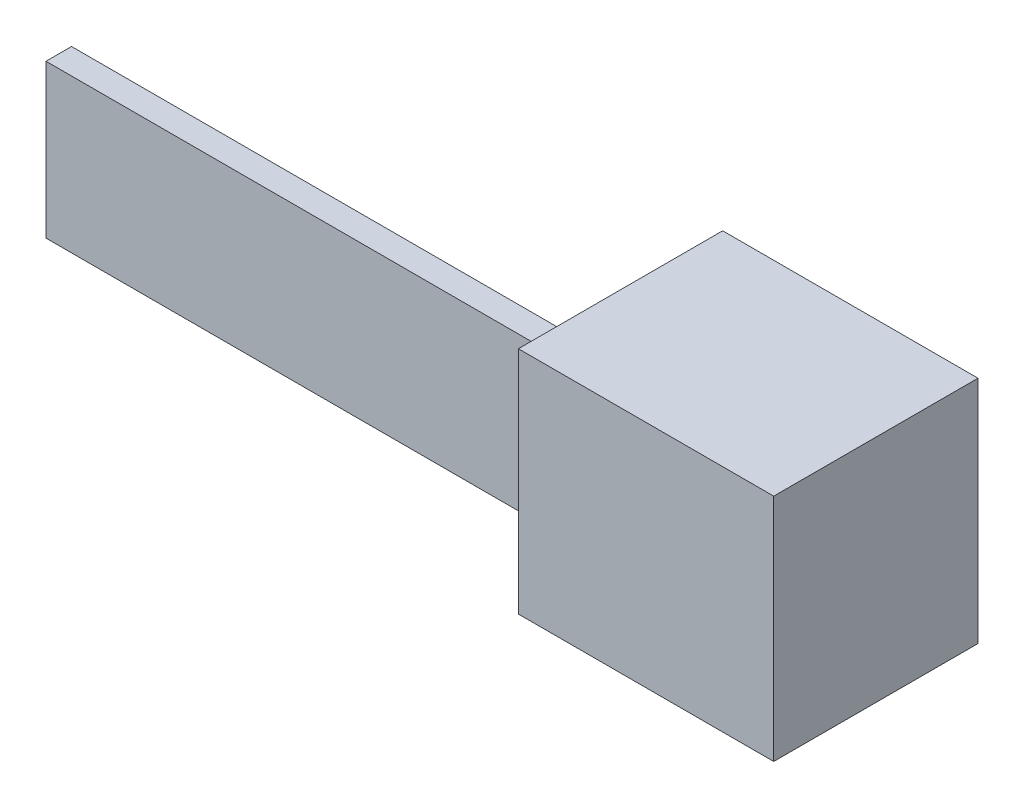
ISO-10303-21;
HEADER;
FILE_DESCRIPTION(('STEP AP214'),'2;1');
FILE_NAME('part.step','',(''),(''),'','','');
FILE_SCHEMA(('AUTOMOTIVE_DESIGN { 1 0 10303 214 1 1 1 1 }'));
ENDSEC;
DATA;
#1=APPLICATION_CONTEXT('core data for automotive mechanical design processes');
#2=APPLICATION_PROTOCOL_DEFINITION('international standard','automotive_design',2000,#1);
#3=PRODUCT_CONTEXT('',#1,'mechanical');
#4=PRODUCT('Part','Part','',(#3));
#5=PRODUCT_RELATED_PRODUCT_CATEGORY('part','',(#4));
#6=PRODUCT_DEFINITION_FORMATION('','',#4);
#7=PRODUCT_DEFINITION_CONTEXT('part definition',#1,'design');
#8=PRODUCT_DEFINITION('design','',#6,#7);
#9=PRODUCT_DEFINITION_SHAPE('','',#8);
#10=(LENGTH_UNIT() NAMED_UNIT(*) SI_UNIT(.MILLI.,.METRE.));
#11=(NAMED_UNIT(*) PLANE_ANGLE_UNIT() SI_UNIT($,.RADIAN.));
#12=(NAMED_UNIT(*) SI_UNIT($,.STERADIAN.) SOLID_ANGLE_UNIT());
#13=UNCERTAINTY_MEASURE_WITH_UNIT(LENGTH_MEASURE(1.E-05),#10,'distance_accuracy_value','');
#14=(GEOMETRIC_REPRESENTATION_CONTEXT(3) GLOBAL_UNCERTAINTY_ASSIGNED_CONTEXT((#13)) GLOBAL_UNIT_ASSIGNED_CONTEXT((#10,
#11,#12)) REPRESENTATION_CONTEXT('',''));
#15=CARTESIAN_POINT('',(0.,0.,0.));
#16=DIRECTION('',(0.,0.,1.));
#17=DIRECTION('',(1.,0.,0.));
#18=AXIS2_PLACEMENT_3D('',#15,#16,#17);
#19=CARTESIAN_POINT('',(0.,3.,-0.500000000000008));
#20=DIRECTION('',(0.,0.,1.));
#21=DIRECTION('',(1.,0.,0.));
#22=AXIS2_PLACEMENT_3D('',#19,#20,#21);
#23=PLANE('',#22);
#24=DIRECTION('',(-1.,0.,0.));
#25=VECTOR('',#24,1.);
#26=CARTESIAN_POINT('',(0.,-3.,-0.500000000000008));
#27=LINE('',#26,#25);
#28=CARTESIAN_POINT('',(0.,-3.,-0.500000000000003));
#29=VERTEX_POINT('',#28);
#30=CARTESIAN_POINT('',(-22.,-3.,-0.499999999999997));
#31=VERTEX_POINT('',#30);
#32=EDGE_CURVE('E136',#29,#31,#27,.T.);
#33=ORIENTED_EDGE('',*,*,#32,.T.);
#34=DIRECTION('',(0.,-1.,0.));
#35=VECTOR('',#34,1.);
#36=CARTESIAN_POINT('',(-22.,3.,-0.499999999999997));
#37=LINE('',#36,#35);
#38=CARTESIAN_POINT('',(-22.,3.,-0.499999999999997));
#39=VERTEX_POINT('',#38);
#40=EDGE_CURVE('E40',#39,#31,#37,.T.);
#41=ORIENTED_EDGE('',*,*,#40,.F.);
#42=DIRECTION('',(-1.,0.,0.));
#43=VECTOR('',#42,1.);
#44=CARTESIAN_POINT('',(0.,3.,-0.500000000000008));
#45=LINE('',#44,#43);
#46=CARTESIAN_POINT('',(0.,3.,-0.5));
#47=VERTEX_POINT('',#46);
#48=EDGE_CURVE('E138',#47,#39,#45,.T.);
#49=ORIENTED_EDGE('',*,*,#48,.F.);
#50=DIRECTION('',(0.,-1.,0.));
#51=VECTOR('',#50,1.);
#52=CARTESIAN_POINT('',(0.,3.,-0.500000000000003));
#53=LINE('',#52,#51);
#54=EDGE_CURVE('E87',#47,#29,#53,.T.);
#55=ORIENTED_EDGE('',*,*,#54,.T.);
#56=EDGE_LOOP('',(#33,#41,#49,#55));
#57=FACE_BOUND('',#56,.T.);
#58=ADVANCED_FACE('F37',(#57),#23,.F.);
#59=CARTESIAN_POINT('',(-22.,3.,0.));
#60=DIRECTION('',(1.,0.,0.));
#61=DIRECTION('',(0.,0.,-1.));
#62=AXIS2_PLACEMENT_3D('',#59,#60,#61);
#63=PLANE('',#62);
#64=DIRECTION('',(0.,0.,1.));
#65=VECTOR('',#64,1.);
#66=CARTESIAN_POINT('',(-22.,-3.,0.));
#67=LINE('',#66,#65);
#68=CARTESIAN_POINT('',(-22.,-3.,0.500000000000003));
#69=VERTEX_POINT('',#68);
#70=EDGE_CURVE('E146',#31,#69,#67,.T.);
#71=ORIENTED_EDGE('',*,*,#70,.T.);
#72=DIRECTION('',(0.,-1.,0.));
#73=VECTOR('',#72,1.);
#74=CARTESIAN_POINT('',(-22.,3.,0.500000000000003));
#75=LINE('',#74,#73);
#76=CARTESIAN_POINT('',(-22.,3.,0.500000000000003));
#77=VERTEX_POINT('',#76);
#78=EDGE_CURVE('E166',#77,#69,#75,.T.);
#79=ORIENTED_EDGE('',*,*,#78,.F.);
#80=DIRECTION('',(0.,0.,1.));
#81=VECTOR('',#80,1.);
#82=CARTESIAN_POINT('',(-22.,3.,0.));
#83=LINE('',#82,#81);
#84=EDGE_CURVE('E93',#39,#77,#83,.T.);
#85=ORIENTED_EDGE('',*,*,#84,.F.);
#86=ORIENTED_EDGE('',*,*,#40,.T.);
#87=EDGE_LOOP('',(#71,#79,#85,#86));
#88=FACE_BOUND('',#87,.T.);
#89=ADVANCED_FACE('F170',(#88),#63,.F.);
#90=CARTESIAN_POINT('',(0.,3.,0.500000000000008));
#91=DIRECTION('',(0.,0.,1.));
#92=DIRECTION('',(1.,0.,0.));
#93=AXIS2_PLACEMENT_3D('',#90,#91,#92);
#94=PLANE('',#93);
#95=DIRECTION('',(-1.,0.,0.));
#96=VECTOR('',#95,1.);
#97=CARTESIAN_POINT('',(0.,-3.,0.500000000000008));
#98=LINE('',#97,#96);
#99=CARTESIAN_POINT('',(0.,-3.,0.500000000000008));
#100=VERTEX_POINT('',#99);
#101=EDGE_CURVE('E149',#100,#69,#98,.T.);
#102=ORIENTED_EDGE('',*,*,#101,.F.);
#103=DIRECTION('',(0.,-1.,0.));
#104=VECTOR('',#103,1.);
#105=CARTESIAN_POINT('',(0.,3.,0.500000000000008));
#106=LINE('',#105,#104);
#107=CARTESIAN_POINT('',(0.,3.,0.500000000000008));
#108=VERTEX_POINT('',#107);
#109=EDGE_CURVE('E117',#108,#100,#106,.T.);
#110=ORIENTED_EDGE('',*,*,#109,.F.);
#111=DIRECTION('',(-1.,0.,0.));
#112=VECTOR('',#111,1.);
#113=CARTESIAN_POINT('',(0.,3.,0.500000000000008));
#114=LINE('',#113,#112);
#115=EDGE_CURVE('E142',#108,#77,#114,.T.);
#116=ORIENTED_EDGE('',*,*,#115,.T.);
#117=ORIENTED_EDGE('',*,*,#78,.T.);
#118=EDGE_LOOP('',(#102,#110,#116,#117));
#119=FACE_BOUND('',#118,.T.);
#120=ADVANCED_FACE('F177',(#119),#94,.T.);
#121=CARTESIAN_POINT('',(0.,3.,4.));
#122=DIRECTION('',(0.,0.,-1.));
#123=DIRECTION('',(-1.,0.,0.));
#124=AXIS2_PLACEMENT_3D('',#121,#122,#123);
#125=PLANE('',#124);
#126=DIRECTION('',(1.,0.,0.));
#127=VECTOR('',#126,1.);
#128=CARTESIAN_POINT('',(0.,-3.,4.));
#129=LINE('',#128,#127);
#130=CARTESIAN_POINT('',(0.,-3.,4.));
#131=VERTEX_POINT('',#130);
#132=CARTESIAN_POINT('',(10.,-3.,4.));
#133=VERTEX_POINT('',#132);
#134=EDGE_CURVE('E153',#131,#133,#129,.T.);
#135=ORIENTED_EDGE('',*,*,#134,.T.);
#136=DIRECTION('',(0.,-1.,0.));
#137=VECTOR('',#136,1.);
#138=CARTESIAN_POINT('',(10.,3.,4.));
#139=LINE('',#138,#137);
#140=CARTESIAN_POINT('',(10.,6.,4.));
#141=VERTEX_POINT('',#140);
#142=EDGE_CURVE('E118',#141,#133,#139,.T.);
#143=ORIENTED_EDGE('',*,*,#142,.F.);
#144=DIRECTION('',(1.,0.,0.));
#145=VECTOR('',#144,1.);
#146=CARTESIAN_POINT('',(0.,6.,4.));
#147=LINE('',#146,#145);
#148=CARTESIAN_POINT('',(0.,6.,4.));
#149=VERTEX_POINT('',#148);
#150=EDGE_CURVE('E121',#149,#141,#147,.T.);
#151=ORIENTED_EDGE('',*,*,#150,.F.);
#152=DIRECTION('',(0.,-1.,0.));
#153=VECTOR('',#152,1.);
#154=CARTESIAN_POINT('',(0.,3.,4.));
#155=LINE('',#154,#153);
#156=EDGE_CURVE('E108',#149,#131,#155,.T.);
#157=ORIENTED_EDGE('',*,*,#156,.T.);
#158=EDGE_LOOP('',(#135,#143,#151,#157));
#159=FACE_BOUND('',#158,.T.);
#160=ADVANCED_FACE('F122',(#159),#125,.F.);
#161=CARTESIAN_POINT('',(10.,3.,0.));
#162=DIRECTION('',(-1.,0.,0.));
#163=DIRECTION('',(0.,0.,1.));
#164=AXIS2_PLACEMENT_3D('',#161,#162,#163);
#165=PLANE('',#164);
#166=DIRECTION('',(0.,0.,-1.));
#167=VECTOR('',#166,1.);
#168=CARTESIAN_POINT('',(10.,-3.,0.));
#169=LINE('',#168,#167);
#170=CARTESIAN_POINT('',(10.,-3.,-4.));
#171=VERTEX_POINT('',#170);
#172=EDGE_CURVE('E155',#133,#171,#169,.T.);
#173=ORIENTED_EDGE('',*,*,#172,.T.);
#174=DIRECTION('',(0.,-1.,0.));
#175=VECTOR('',#174,1.);
#176=CARTESIAN_POINT('',(10.,3.,-4.));
#177=LINE('',#176,#175);
#178=CARTESIAN_POINT('',(10.,6.,-4.));
#179=VERTEX_POINT('',#178);
#180=EDGE_CURVE('E163',#179,#171,#177,.T.);
#181=ORIENTED_EDGE('',*,*,#180,.F.);
#182=DIRECTION('',(0.,0.,-1.));
#183=VECTOR('',#182,1.);
#184=CARTESIAN_POINT('',(10.,6.,-4.));
#185=LINE('',#184,#183);
#186=EDGE_CURVE('E127',#141,#179,#185,.T.);
#187=ORIENTED_EDGE('',*,*,#186,.F.);
#188=ORIENTED_EDGE('',*,*,#142,.T.);
#189=EDGE_LOOP('',(#173,#181,#187,#188));
#190=FACE_BOUND('',#189,.T.);
#191=ADVANCED_FACE('F180',(#190),#165,.F.);
#192=CARTESIAN_POINT('',(0.,3.,-4.));
#193=DIRECTION('',(0.,0.,-1.));
#194=DIRECTION('',(-1.,0.,0.));
#195=AXIS2_PLACEMENT_3D('',#192,#193,#194);
#196=PLANE('',#195);
#197=DIRECTION('',(1.,0.,0.));
#198=VECTOR('',#197,1.);
#199=CARTESIAN_POINT('',(0.,-3.,-4.));
#200=LINE('',#199,#198);
#201=CARTESIAN_POINT('',(0.,-3.,-4.));
#202=VERTEX_POINT('',#201);
#203=EDGE_CURVE('E158',#202,#171,#200,.T.);
#204=ORIENTED_EDGE('',*,*,#203,.F.);
#205=DIRECTION('',(0.,-1.,0.));
#206=VECTOR('',#205,1.);
#207=CARTESIAN_POINT('',(0.,3.,-4.));
#208=LINE('',#207,#206);
#209=CARTESIAN_POINT('',(0.,6.,-4.));
#210=VERTEX_POINT('',#209);
#211=EDGE_CURVE('E81',#210,#202,#208,.T.);
#212=ORIENTED_EDGE('',*,*,#211,.F.);
#213=DIRECTION('',(-1.,0.,0.));
#214=VECTOR('',#213,1.);
#215=CARTESIAN_POINT('',(0.,6.,-4.));
#216=LINE('',#215,#214);
#217=EDGE_CURVE('E132',#179,#210,#216,.T.);
#218=ORIENTED_EDGE('',*,*,#217,.F.);
#219=ORIENTED_EDGE('',*,*,#180,.T.);
#220=EDGE_LOOP('',(#204,#212,#218,#219));
#221=FACE_BOUND('',#220,.T.);
#222=ADVANCED_FACE('F182',(#221),#196,.T.);
#223=CARTESIAN_POINT('',(0.,3.,0.));
#224=DIRECTION('',(-1.,0.,0.));
#225=DIRECTION('',(0.,0.,1.));
#226=AXIS2_PLACEMENT_3D('',#223,#224,#225);
#227=PLANE('',#226);
#228=DIRECTION('',(0.,0.,-1.));
#229=VECTOR('',#228,1.);
#230=CARTESIAN_POINT('',(0.,-3.,0.));
#231=LINE('',#230,#229);
#232=EDGE_CURVE('E140',#29,#202,#231,.T.);
#233=ORIENTED_EDGE('',*,*,#232,.F.);
#234=ORIENTED_EDGE('',*,*,#54,.F.);
#235=DIRECTION('',(0.,0.,1.));
#236=VECTOR('',#235,1.);
#237=CARTESIAN_POINT('',(0.,3.,-4.));
#238=LINE('',#237,#236);
#239=EDGE_CURVE('E11',#47,#108,#238,.T.);
#240=ORIENTED_EDGE('',*,*,#239,.T.);
#241=ORIENTED_EDGE('',*,*,#109,.T.);
#242=EDGE_CURVE('E114',#131,#100,#231,.T.);
#243=ORIENTED_EDGE('',*,*,#242,.F.);
#244=ORIENTED_EDGE('',*,*,#156,.F.);
#245=DIRECTION('',(0.,0.,1.));
#246=VECTOR('',#245,1.);
#247=CARTESIAN_POINT('',(0.,6.,-4.));
#248=LINE('',#247,#246);
#249=EDGE_CURVE('E112',#210,#149,#248,.T.);
#250=ORIENTED_EDGE('',*,*,#249,.F.);
#251=ORIENTED_EDGE('',*,*,#211,.T.);
#252=EDGE_LOOP('',(#233,#234,#240,#241,#243,#244,#250,#251));
#253=FACE_BOUND('',#252,.T.);
#254=ADVANCED_FACE('F110',(#253),#227,.T.);
#255=CARTESIAN_POINT('',(0.,3.,0.));
#256=DIRECTION('',(0.,1.,0.));
#257=DIRECTION('',(0.,0.,1.));
#258=AXIS2_PLACEMENT_3D('',#255,#256,#257);
#259=PLANE('',#258);
#260=ORIENTED_EDGE('',*,*,#239,.F.);
#261=ORIENTED_EDGE('',*,*,#48,.T.);
#262=ORIENTED_EDGE('',*,*,#84,.T.);
#263=ORIENTED_EDGE('',*,*,#115,.F.);
#264=EDGE_LOOP('',(#260,#261,#262,#263));
#265=FACE_BOUND('',#264,.T.);
#266=ADVANCED_FACE('F175',(#265),#259,.T.);
#267=CARTESIAN_POINT('',(0.,-3.,0.));
#268=DIRECTION('',(0.,1.,0.));
#269=DIRECTION('',(0.,0.,1.));
#270=AXIS2_PLACEMENT_3D('',#267,#268,#269);
#271=PLANE('',#270);
#272=ORIENTED_EDGE('',*,*,#32,.F.);
#273=ORIENTED_EDGE('',*,*,#232,.T.);
#274=ORIENTED_EDGE('',*,*,#203,.T.);
#275=ORIENTED_EDGE('',*,*,#172,.F.);
#276=ORIENTED_EDGE('',*,*,#134,.F.);
#277=ORIENTED_EDGE('',*,*,#242,.T.);
#278=ORIENTED_EDGE('',*,*,#101,.T.);
#279=ORIENTED_EDGE('',*,*,#70,.F.);
#280=EDGE_LOOP('',(#272,#273,#274,#275,#276,#277,#278,#279));
#281=FACE_BOUND('',#280,.T.);
#282=ADVANCED_FACE('F173',(#281),#271,.F.);
#283=CARTESIAN_POINT('',(0.,6.,0.));
#284=DIRECTION('',(0.,1.,0.));
#285=DIRECTION('',(0.,0.,1.));
#286=AXIS2_PLACEMENT_3D('',#283,#284,#285);
#287=PLANE('',#286);
#288=ORIENTED_EDGE('',*,*,#249,.T.);
#289=ORIENTED_EDGE('',*,*,#150,.T.);
#290=ORIENTED_EDGE('',*,*,#186,.T.);
#291=ORIENTED_EDGE('',*,*,#217,.T.);
#292=EDGE_LOOP('',(#288,#289,#290,#291));
#293=FACE_BOUND('',#292,.T.);
#294=ADVANCED_FACE('F130',(#293),#287,.T.);
#295=CLOSED_SHELL('',(#58,#89,#120,#160,#191,#222,#254,#266,#282,#294));
#296=MANIFOLD_SOLID_BREP('B2',#295);
#297=ADVANCED_BREP_SHAPE_REPRESENTATION('',(#18,#296),#14);
#298=SHAPE_DEFINITION_REPRESENTATION(#9,#297);
ENDSEC;
END-ISO-10303-21;
